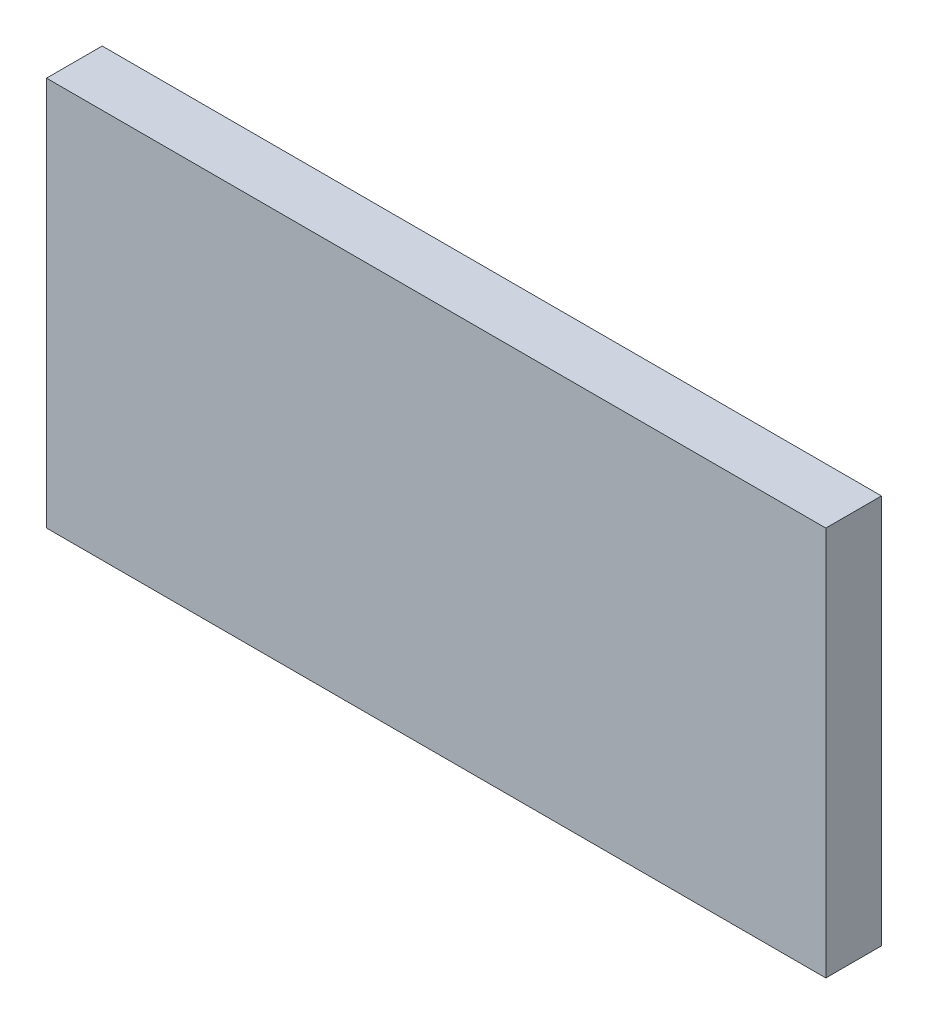
ISO-10303-21;
HEADER;
FILE_DESCRIPTION(('STEP AP214'),'2;1');
FILE_NAME('part.step','',(''),(''),'','','');
FILE_SCHEMA(('AUTOMOTIVE_DESIGN { 1 0 10303 214 1 1 1 1 }'));
ENDSEC;
DATA;
#1=APPLICATION_CONTEXT('core data for automotive mechanical design processes');
#2=APPLICATION_PROTOCOL_DEFINITION('international standard','automotive_design',2000,#1);
#3=PRODUCT_CONTEXT('',#1,'mechanical');
#4=PRODUCT('Part','Part','',(#3));
#5=PRODUCT_RELATED_PRODUCT_CATEGORY('part','',(#4));
#6=PRODUCT_DEFINITION_FORMATION('','',#4);
#7=PRODUCT_DEFINITION_CONTEXT('part definition',#1,'design');
#8=PRODUCT_DEFINITION('design','',#6,#7);
#9=PRODUCT_DEFINITION_SHAPE('','',#8);
#10=(LENGTH_UNIT() NAMED_UNIT(*) SI_UNIT(.MILLI.,.METRE.));
#11=(NAMED_UNIT(*) PLANE_ANGLE_UNIT() SI_UNIT($,.RADIAN.));
#12=(NAMED_UNIT(*) SI_UNIT($,.STERADIAN.) SOLID_ANGLE_UNIT());
#13=UNCERTAINTY_MEASURE_WITH_UNIT(LENGTH_MEASURE(1.E-05),#10,'distance_accuracy_value','');
#14=(GEOMETRIC_REPRESENTATION_CONTEXT(3) GLOBAL_UNCERTAINTY_ASSIGNED_CONTEXT((#13)) GLOBAL_UNIT_ASSIGNED_CONTEXT((#10,
#11,#12)) REPRESENTATION_CONTEXT('',''));
#15=CARTESIAN_POINT('',(0.,0.,0.));
#16=DIRECTION('',(0.,0.,1.));
#17=DIRECTION('',(1.,0.,0.));
#18=AXIS2_PLACEMENT_3D('',#15,#16,#17);
#19=CARTESIAN_POINT('',(0.,0.,6.35));
#20=DIRECTION('',(-1.,0.,0.));
#21=DIRECTION('',(0.,-1.,0.));
#22=AXIS2_PLACEMENT_3D('',#19,#20,#21);
#23=PLANE('',#22);
#24=DIRECTION('',(0.,1.,0.));
#25=VECTOR('',#24,1.);
#26=CARTESIAN_POINT('',(0.,0.,0.));
#27=LINE('',#26,#25);
#28=CARTESIAN_POINT('',(0.,0.,0.));
#29=VERTEX_POINT('',#28);
#30=CARTESIAN_POINT('',(0.,44.45,0.));
#31=VERTEX_POINT('',#30);
#32=EDGE_CURVE('E100',#29,#31,#27,.T.);
#33=ORIENTED_EDGE('',*,*,#32,.T.);
#34=DIRECTION('',(0.,0.,-1.));
#35=VECTOR('',#34,1.);
#36=CARTESIAN_POINT('',(0.,44.45,6.35));
#37=LINE('',#36,#35);
#38=CARTESIAN_POINT('',(0.,44.45,6.35));
#39=VERTEX_POINT('',#38);
#40=EDGE_CURVE('E11',#39,#31,#37,.T.);
#41=ORIENTED_EDGE('',*,*,#40,.F.);
#42=DIRECTION('',(0.,1.,0.));
#43=VECTOR('',#42,1.);
#44=CARTESIAN_POINT('',(0.,0.,6.35));
#45=LINE('',#44,#43);
#46=CARTESIAN_POINT('',(0.,0.,6.35));
#47=VERTEX_POINT('',#46);
#48=EDGE_CURVE('E88',#47,#39,#45,.T.);
#49=ORIENTED_EDGE('',*,*,#48,.F.);
#50=DIRECTION('',(0.,0.,-1.));
#51=VECTOR('',#50,1.);
#52=CARTESIAN_POINT('',(0.,0.,6.35));
#53=LINE('',#52,#51);
#54=EDGE_CURVE('E96',#47,#29,#53,.T.);
#55=ORIENTED_EDGE('',*,*,#54,.T.);
#56=EDGE_LOOP('',(#33,#41,#49,#55));
#57=FACE_BOUND('',#56,.T.);
#58=ADVANCED_FACE('F37',(#57),#23,.F.);
#59=CARTESIAN_POINT('',(0.,44.45,6.35));
#60=DIRECTION('',(0.,-1.,0.));
#61=DIRECTION('',(1.,0.,0.));
#62=AXIS2_PLACEMENT_3D('',#59,#60,#61);
#63=PLANE('',#62);
#64=DIRECTION('',(-1.,0.,0.));
#65=VECTOR('',#64,1.);
#66=CARTESIAN_POINT('',(0.,44.45,0.));
#67=LINE('',#66,#65);
#68=CARTESIAN_POINT('',(-88.9,44.45,0.));
#69=VERTEX_POINT('',#68);
#70=EDGE_CURVE('E92',#31,#69,#67,.T.);
#71=ORIENTED_EDGE('',*,*,#70,.T.);
#72=DIRECTION('',(0.,0.,-1.));
#73=VECTOR('',#72,1.);
#74=CARTESIAN_POINT('',(-88.9,44.45,6.35));
#75=LINE('',#74,#73);
#76=CARTESIAN_POINT('',(-88.9,44.45,6.35));
#77=VERTEX_POINT('',#76);
#78=EDGE_CURVE('E45',#77,#69,#75,.T.);
#79=ORIENTED_EDGE('',*,*,#78,.F.);
#80=DIRECTION('',(-1.,0.,0.));
#81=VECTOR('',#80,1.);
#82=CARTESIAN_POINT('',(0.,44.45,6.35));
#83=LINE('',#82,#81);
#84=EDGE_CURVE('E83',#39,#77,#83,.T.);
#85=ORIENTED_EDGE('',*,*,#84,.F.);
#86=ORIENTED_EDGE('',*,*,#40,.T.);
#87=EDGE_LOOP('',(#71,#79,#85,#86));
#88=FACE_BOUND('',#87,.T.);
#89=ADVANCED_FACE('F91',(#88),#63,.F.);
#90=CARTESIAN_POINT('',(-88.9,0.,6.35));
#91=DIRECTION('',(1.,0.,0.));
#92=DIRECTION('',(0.,0.,-1.));
#93=AXIS2_PLACEMENT_3D('',#90,#91,#92);
#94=PLANE('',#93);
#95=DIRECTION('',(0.,-1.,0.));
#96=VECTOR('',#95,1.);
#97=CARTESIAN_POINT('',(-88.9,0.,0.));
#98=LINE('',#97,#96);
#99=CARTESIAN_POINT('',(-88.9,0.,0.));
#100=VERTEX_POINT('',#99);
#101=EDGE_CURVE('E70',#69,#100,#98,.T.);
#102=ORIENTED_EDGE('',*,*,#101,.T.);
#103=DIRECTION('',(0.,0.,-1.));
#104=VECTOR('',#103,1.);
#105=CARTESIAN_POINT('',(-88.9,0.,6.35));
#106=LINE('',#105,#104);
#107=CARTESIAN_POINT('',(-88.9,0.,6.35));
#108=VERTEX_POINT('',#107);
#109=EDGE_CURVE('E93',#108,#100,#106,.T.);
#110=ORIENTED_EDGE('',*,*,#109,.F.);
#111=DIRECTION('',(0.,-1.,0.));
#112=VECTOR('',#111,1.);
#113=CARTESIAN_POINT('',(-88.9,0.,6.35));
#114=LINE('',#113,#112);
#115=EDGE_CURVE('E86',#77,#108,#114,.T.);
#116=ORIENTED_EDGE('',*,*,#115,.F.);
#117=ORIENTED_EDGE('',*,*,#78,.T.);
#118=EDGE_LOOP('',(#102,#110,#116,#117));
#119=FACE_BOUND('',#118,.T.);
#120=ADVANCED_FACE('F94',(#119),#94,.F.);
#121=CARTESIAN_POINT('',(0.,0.,6.35));
#122=DIRECTION('',(0.,1.,0.));
#123=DIRECTION('',(-1.,0.,0.));
#124=AXIS2_PLACEMENT_3D('',#121,#122,#123);
#125=PLANE('',#124);
#126=DIRECTION('',(1.,0.,0.));
#127=VECTOR('',#126,1.);
#128=CARTESIAN_POINT('',(0.,0.,0.));
#129=LINE('',#128,#127);
#130=EDGE_CURVE('E76',#100,#29,#129,.T.);
#131=ORIENTED_EDGE('',*,*,#130,.T.);
#132=ORIENTED_EDGE('',*,*,#54,.F.);
#133=DIRECTION('',(1.,0.,0.));
#134=VECTOR('',#133,1.);
#135=CARTESIAN_POINT('',(0.,0.,6.35));
#136=LINE('',#135,#134);
#137=EDGE_CURVE('E53',#108,#47,#136,.T.);
#138=ORIENTED_EDGE('',*,*,#137,.F.);
#139=ORIENTED_EDGE('',*,*,#109,.T.);
#140=EDGE_LOOP('',(#131,#132,#138,#139));
#141=FACE_BOUND('',#140,.T.);
#142=ADVANCED_FACE('F107',(#141),#125,.F.);
#143=CARTESIAN_POINT('',(0.,0.,6.35));
#144=DIRECTION('',(0.,0.,1.));
#145=DIRECTION('',(1.,0.,0.));
#146=AXIS2_PLACEMENT_3D('',#143,#144,#145);
#147=PLANE('',#146);
#148=ORIENTED_EDGE('',*,*,#48,.T.);
#149=ORIENTED_EDGE('',*,*,#84,.T.);
#150=ORIENTED_EDGE('',*,*,#115,.T.);
#151=ORIENTED_EDGE('',*,*,#137,.T.);
#152=EDGE_LOOP('',(#148,#149,#150,#151));
#153=FACE_BOUND('',#152,.T.);
#154=ADVANCED_FACE('F84',(#153),#147,.T.);
#155=CARTESIAN_POINT('',(0.,0.,0.));
#156=DIRECTION('',(0.,0.,1.));
#157=DIRECTION('',(1.,0.,0.));
#158=AXIS2_PLACEMENT_3D('',#155,#156,#157);
#159=PLANE('',#158);
#160=ORIENTED_EDGE('',*,*,#32,.F.);
#161=ORIENTED_EDGE('',*,*,#130,.F.);
#162=ORIENTED_EDGE('',*,*,#101,.F.);
#163=ORIENTED_EDGE('',*,*,#70,.F.);
#164=EDGE_LOOP('',(#160,#161,#162,#163));
#165=FACE_BOUND('',#164,.T.);
#166=ADVANCED_FACE('F110',(#165),#159,.F.);
#167=CLOSED_SHELL('',(#58,#89,#120,#142,#154,#166));
#168=MANIFOLD_SOLID_BREP('B2',#167);
#169=ADVANCED_BREP_SHAPE_REPRESENTATION('',(#18,#168),#14);
#170=SHAPE_DEFINITION_REPRESENTATION(#9,#169);
ENDSEC;
END-ISO-10303-21;
